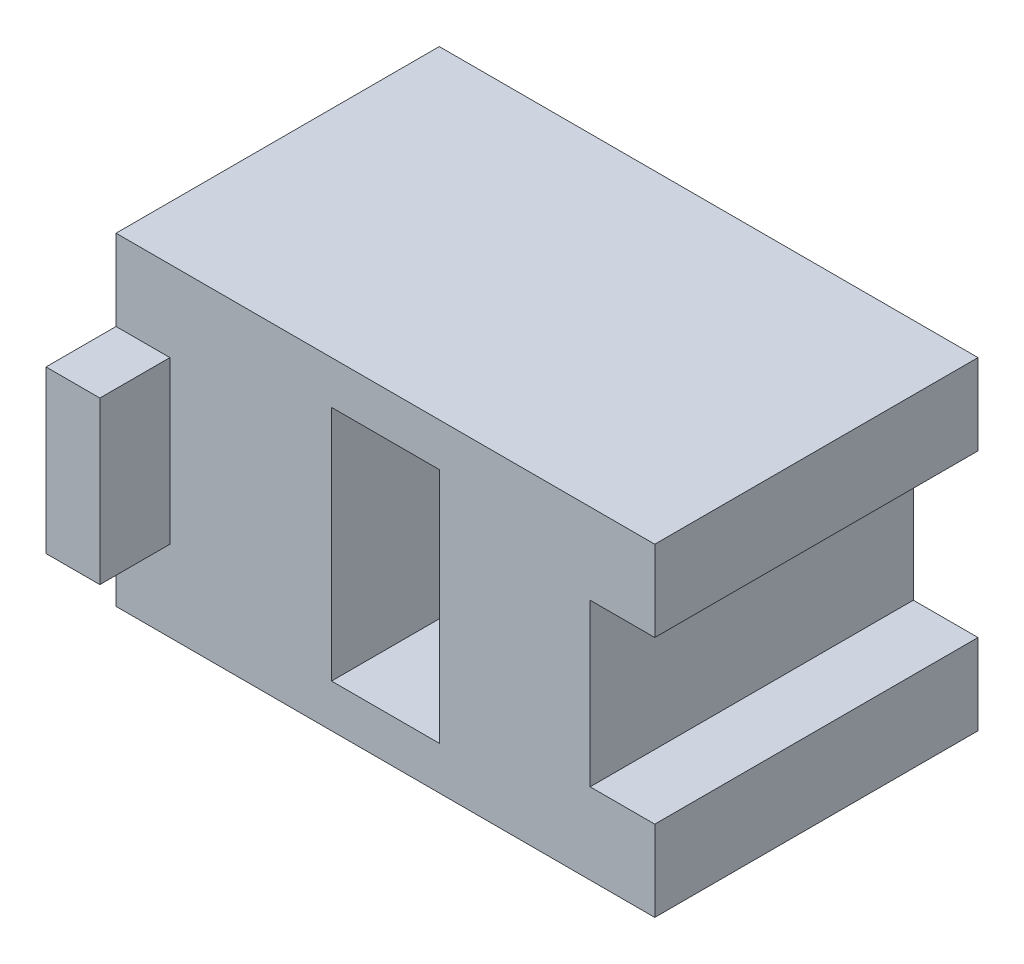
ISO-10303-21;
HEADER;
FILE_DESCRIPTION(('STEP AP214'),'2;1');
FILE_NAME('part.step','',(''),(''),'','','');
FILE_SCHEMA(('AUTOMOTIVE_DESIGN { 1 0 10303 214 1 1 1 1 }'));
ENDSEC;
DATA;
#1=APPLICATION_CONTEXT('core data for automotive mechanical design processes');
#2=APPLICATION_PROTOCOL_DEFINITION('international standard','automotive_design',2000,#1);
#3=PRODUCT_CONTEXT('',#1,'mechanical');
#4=PRODUCT('Part','Part','',(#3));
#5=PRODUCT_RELATED_PRODUCT_CATEGORY('part','',(#4));
#6=PRODUCT_DEFINITION_FORMATION('','',#4);
#7=PRODUCT_DEFINITION_CONTEXT('part definition',#1,'design');
#8=PRODUCT_DEFINITION('design','',#6,#7);
#9=PRODUCT_DEFINITION_SHAPE('','',#8);
#10=(LENGTH_UNIT() NAMED_UNIT(*) SI_UNIT(.MILLI.,.METRE.));
#11=(NAMED_UNIT(*) PLANE_ANGLE_UNIT() SI_UNIT($,.RADIAN.));
#12=(NAMED_UNIT(*) SI_UNIT($,.STERADIAN.) SOLID_ANGLE_UNIT());
#13=UNCERTAINTY_MEASURE_WITH_UNIT(LENGTH_MEASURE(1.E-05),#10,'distance_accuracy_value','');
#14=(GEOMETRIC_REPRESENTATION_CONTEXT(3) GLOBAL_UNCERTAINTY_ASSIGNED_CONTEXT((#13)) GLOBAL_UNIT_ASSIGNED_CONTEXT((#10,
#11,#12)) REPRESENTATION_CONTEXT('',''));
#15=CARTESIAN_POINT('',(0.,0.,0.));
#16=DIRECTION('',(0.,0.,1.));
#17=DIRECTION('',(1.,0.,0.));
#18=AXIS2_PLACEMENT_3D('',#15,#16,#17);
#19=CARTESIAN_POINT('',(0.,0.,30.));
#20=DIRECTION('',(0.,0.,-1.));
#21=DIRECTION('',(-1.,0.,0.));
#22=AXIS2_PLACEMENT_3D('',#19,#20,#21);
#23=PLANE('',#22);
#24=DIRECTION('',(-1.,0.,0.));
#25=VECTOR('',#24,1.);
#26=CARTESIAN_POINT('',(-5.,11.,30.));
#27=LINE('',#26,#25);
#28=CARTESIAN_POINT('',(5.,11.,30.));
#29=VERTEX_POINT('',#28);
#30=CARTESIAN_POINT('',(-5.,11.,30.));
#31=VERTEX_POINT('',#30);
#32=EDGE_CURVE('E219',#29,#31,#27,.T.);
#33=ORIENTED_EDGE('',*,*,#32,.F.);
#34=DIRECTION('',(0.,1.,0.));
#35=VECTOR('',#34,1.);
#36=CARTESIAN_POINT('',(5.,-11.,30.));
#37=LINE('',#36,#35);
#38=CARTESIAN_POINT('',(5.,-11.,30.));
#39=VERTEX_POINT('',#38);
#40=EDGE_CURVE('E217',#39,#29,#37,.T.);
#41=ORIENTED_EDGE('',*,*,#40,.F.);
#42=DIRECTION('',(1.,0.,0.));
#43=VECTOR('',#42,1.);
#44=CARTESIAN_POINT('',(-5.,-11.,30.));
#45=LINE('',#44,#43);
#46=CARTESIAN_POINT('',(-5.,-11.,30.));
#47=VERTEX_POINT('',#46);
#48=EDGE_CURVE('E225',#47,#39,#45,.T.);
#49=ORIENTED_EDGE('',*,*,#48,.F.);
#50=DIRECTION('',(0.,-1.,0.));
#51=VECTOR('',#50,1.);
#52=CARTESIAN_POINT('',(-5.,-11.,30.));
#53=LINE('',#52,#51);
#54=EDGE_CURVE('E223',#31,#47,#53,.T.);
#55=ORIENTED_EDGE('',*,*,#54,.F.);
#56=EDGE_LOOP('',(#33,#41,#49,#55));
#57=FACE_BOUND('',#56,.T.);
#58=DIRECTION('',(-1.,0.,0.));
#59=VECTOR('',#58,1.);
#60=CARTESIAN_POINT('',(-20.,7.5,30.));
#61=LINE('',#60,#59);
#62=CARTESIAN_POINT('',(-20.,7.5,30.));
#63=VERTEX_POINT('',#62);
#64=CARTESIAN_POINT('',(-25.,7.5,30.));
#65=VERTEX_POINT('',#64);
#66=EDGE_CURVE('E59',#63,#65,#61,.T.);
#67=ORIENTED_EDGE('',*,*,#66,.F.);
#68=DIRECTION('',(0.,1.,0.));
#69=VECTOR('',#68,1.);
#70=CARTESIAN_POINT('',(-20.,-7.5,30.));
#71=LINE('',#70,#69);
#72=CARTESIAN_POINT('',(-20.,-7.5,30.));
#73=VERTEX_POINT('',#72);
#74=EDGE_CURVE('E280',#73,#63,#71,.T.);
#75=ORIENTED_EDGE('',*,*,#74,.F.);
#76=DIRECTION('',(1.,0.,0.));
#77=VECTOR('',#76,1.);
#78=CARTESIAN_POINT('',(-20.,-7.5,30.));
#79=LINE('',#78,#77);
#80=CARTESIAN_POINT('',(-25.,-7.5,30.));
#81=VERTEX_POINT('',#80);
#82=EDGE_CURVE('E383',#81,#73,#79,.T.);
#83=ORIENTED_EDGE('',*,*,#82,.F.);
#84=DIRECTION('',(0.,-1.,0.));
#85=VECTOR('',#84,1.);
#86=CARTESIAN_POINT('',(-25.,-15.,30.));
#87=LINE('',#86,#85);
#88=CARTESIAN_POINT('',(-25.,-15.,30.));
#89=VERTEX_POINT('',#88);
#90=EDGE_CURVE('E244',#81,#89,#87,.T.);
#91=ORIENTED_EDGE('',*,*,#90,.T.);
#92=DIRECTION('',(1.,0.,0.));
#93=VECTOR('',#92,1.);
#94=CARTESIAN_POINT('',(-25.,-15.,30.));
#95=LINE('',#94,#93);
#96=CARTESIAN_POINT('',(25.,-15.,30.));
#97=VERTEX_POINT('',#96);
#98=EDGE_CURVE('E247',#89,#97,#95,.T.);
#99=ORIENTED_EDGE('',*,*,#98,.T.);
#100=DIRECTION('',(0.,1.,0.));
#101=VECTOR('',#100,1.);
#102=CARTESIAN_POINT('',(25.,-15.,30.));
#103=LINE('',#102,#101);
#104=CARTESIAN_POINT('',(25.,-7.5,30.));
#105=VERTEX_POINT('',#104);
#106=EDGE_CURVE('E238',#97,#105,#103,.T.);
#107=ORIENTED_EDGE('',*,*,#106,.T.);
#108=DIRECTION('',(1.,0.,0.));
#109=VECTOR('',#108,1.);
#110=CARTESIAN_POINT('',(19.,-7.5,30.));
#111=LINE('',#110,#109);
#112=CARTESIAN_POINT('',(19.,-7.5,30.));
#113=VERTEX_POINT('',#112);
#114=EDGE_CURVE('E297',#113,#105,#111,.T.);
#115=ORIENTED_EDGE('',*,*,#114,.F.);
#116=DIRECTION('',(0.,-1.,0.));
#117=VECTOR('',#116,1.);
#118=CARTESIAN_POINT('',(19.,-7.5,30.));
#119=LINE('',#118,#117);
#120=CARTESIAN_POINT('',(19.,7.5,30.));
#121=VERTEX_POINT('',#120);
#122=EDGE_CURVE('E307',#121,#113,#119,.T.);
#123=ORIENTED_EDGE('',*,*,#122,.F.);
#124=DIRECTION('',(-1.,0.,0.));
#125=VECTOR('',#124,1.);
#126=CARTESIAN_POINT('',(19.,7.5,30.));
#127=LINE('',#126,#125);
#128=CARTESIAN_POINT('',(25.,7.5,30.));
#129=VERTEX_POINT('',#128);
#130=EDGE_CURVE('E304',#129,#121,#127,.T.);
#131=ORIENTED_EDGE('',*,*,#130,.F.);
#132=CARTESIAN_POINT('',(25.,15.,30.));
#133=VERTEX_POINT('',#132);
#134=EDGE_CURVE('E242',#129,#133,#103,.T.);
#135=ORIENTED_EDGE('',*,*,#134,.T.);
#136=DIRECTION('',(-1.,0.,0.));
#137=VECTOR('',#136,1.);
#138=CARTESIAN_POINT('',(-25.,15.,30.));
#139=LINE('',#138,#137);
#140=CARTESIAN_POINT('',(-25.,15.,30.));
#141=VERTEX_POINT('',#140);
#142=EDGE_CURVE('E241',#133,#141,#139,.T.);
#143=ORIENTED_EDGE('',*,*,#142,.T.);
#144=EDGE_CURVE('E253',#141,#65,#87,.T.);
#145=ORIENTED_EDGE('',*,*,#144,.T.);
#146=EDGE_LOOP('',(#67,#75,#83,#91,#99,#107,#115,#123,#131,#135,#143,#145));
#147=FACE_BOUND('',#146,.T.);
#148=ADVANCED_FACE('F34',(#57,#147),#23,.F.);
#149=CARTESIAN_POINT('',(25.,-15.,30.));
#150=DIRECTION('',(-1.,0.,0.));
#151=DIRECTION('',(0.,0.,1.));
#152=AXIS2_PLACEMENT_3D('',#149,#150,#151);
#153=PLANE('',#152);
#154=DIRECTION('',(0.,1.,0.));
#155=VECTOR('',#154,1.);
#156=CARTESIAN_POINT('',(25.,-15.,0.));
#157=LINE('',#156,#155);
#158=CARTESIAN_POINT('',(25.,-15.,0.));
#159=VERTEX_POINT('',#158);
#160=CARTESIAN_POINT('',(25.,-7.5,0.));
#161=VERTEX_POINT('',#160);
#162=EDGE_CURVE('E370',#159,#161,#157,.T.);
#163=ORIENTED_EDGE('',*,*,#162,.T.);
#164=DIRECTION('',(0.,0.,1.));
#165=VECTOR('',#164,1.);
#166=CARTESIAN_POINT('',(25.,-7.5,0.));
#167=LINE('',#166,#165);
#168=EDGE_CURVE('E220',#161,#105,#167,.T.);
#169=ORIENTED_EDGE('',*,*,#168,.T.);
#170=ORIENTED_EDGE('',*,*,#106,.F.);
#171=DIRECTION('',(0.,0.,-1.));
#172=VECTOR('',#171,1.);
#173=CARTESIAN_POINT('',(25.,-15.,30.));
#174=LINE('',#173,#172);
#175=EDGE_CURVE('E260',#97,#159,#174,.T.);
#176=ORIENTED_EDGE('',*,*,#175,.T.);
#177=EDGE_LOOP('',(#163,#169,#170,#176));
#178=FACE_BOUND('',#177,.T.);
#179=ADVANCED_FACE('F340',(#178),#153,.F.);
#180=ORIENTED_EDGE('',*,*,#134,.F.);
#181=DIRECTION('',(0.,0.,1.));
#182=VECTOR('',#181,1.);
#183=CARTESIAN_POINT('',(25.,7.5,0.));
#184=LINE('',#183,#182);
#185=CARTESIAN_POINT('',(25.,7.5,0.));
#186=VERTEX_POINT('',#185);
#187=EDGE_CURVE('E303',#186,#129,#184,.T.);
#188=ORIENTED_EDGE('',*,*,#187,.F.);
#189=CARTESIAN_POINT('',(25.,15.,0.));
#190=VERTEX_POINT('',#189);
#191=EDGE_CURVE('E231',#186,#190,#157,.T.);
#192=ORIENTED_EDGE('',*,*,#191,.T.);
#193=DIRECTION('',(0.,0.,-1.));
#194=VECTOR('',#193,1.);
#195=CARTESIAN_POINT('',(25.,15.,30.));
#196=LINE('',#195,#194);
#197=EDGE_CURVE('E11',#133,#190,#196,.T.);
#198=ORIENTED_EDGE('',*,*,#197,.F.);
#199=EDGE_LOOP('',(#180,#188,#192,#198));
#200=FACE_BOUND('',#199,.T.);
#201=ADVANCED_FACE('F36',(#200),#153,.F.);
#202=CARTESIAN_POINT('',(-25.,15.,30.));
#203=DIRECTION('',(0.,-1.,0.));
#204=DIRECTION('',(0.,0.,-1.));
#205=AXIS2_PLACEMENT_3D('',#202,#203,#204);
#206=PLANE('',#205);
#207=DIRECTION('',(-1.,0.,0.));
#208=VECTOR('',#207,1.);
#209=CARTESIAN_POINT('',(-25.,15.,0.));
#210=LINE('',#209,#208);
#211=CARTESIAN_POINT('',(-25.,15.,0.));
#212=VERTEX_POINT('',#211);
#213=EDGE_CURVE('E267',#190,#212,#210,.T.);
#214=ORIENTED_EDGE('',*,*,#213,.T.);
#215=DIRECTION('',(0.,0.,-1.));
#216=VECTOR('',#215,1.);
#217=CARTESIAN_POINT('',(-25.,15.,30.));
#218=LINE('',#217,#216);
#219=EDGE_CURVE('E43',#141,#212,#218,.T.);
#220=ORIENTED_EDGE('',*,*,#219,.F.);
#221=ORIENTED_EDGE('',*,*,#142,.F.);
#222=ORIENTED_EDGE('',*,*,#197,.T.);
#223=EDGE_LOOP('',(#214,#220,#221,#222));
#224=FACE_BOUND('',#223,.T.);
#225=ADVANCED_FACE('F356',(#224),#206,.F.);
#226=CARTESIAN_POINT('',(-25.,-15.,30.));
#227=DIRECTION('',(1.,0.,0.));
#228=DIRECTION('',(0.,0.,-1.));
#229=AXIS2_PLACEMENT_3D('',#226,#227,#228);
#230=PLANE('',#229);
#231=DIRECTION('',(0.,-1.,0.));
#232=VECTOR('',#231,1.);
#233=CARTESIAN_POINT('',(-25.,-15.,0.));
#234=LINE('',#233,#232);
#235=CARTESIAN_POINT('',(-25.,6.,0.));
#236=VERTEX_POINT('',#235);
#237=EDGE_CURVE('E264',#212,#236,#234,.T.);
#238=ORIENTED_EDGE('',*,*,#237,.T.);
#239=DIRECTION('',(0.,0.,1.));
#240=VECTOR('',#239,1.);
#241=CARTESIAN_POINT('',(-25.,6.,0.));
#242=LINE('',#241,#240);
#243=CARTESIAN_POINT('',(-25.,6.,-5.));
#244=VERTEX_POINT('',#243);
#245=EDGE_CURVE('E176',#244,#236,#242,.T.);
#246=ORIENTED_EDGE('',*,*,#245,.F.);
#247=DIRECTION('',(0.,1.,0.));
#248=VECTOR('',#247,1.);
#249=CARTESIAN_POINT('',(-25.,-6.,-5.));
#250=LINE('',#249,#248);
#251=CARTESIAN_POINT('',(-25.,-6.,-5.));
#252=VERTEX_POINT('',#251);
#253=EDGE_CURVE('E173',#252,#244,#250,.T.);
#254=ORIENTED_EDGE('',*,*,#253,.F.);
#255=DIRECTION('',(0.,0.,1.));
#256=VECTOR('',#255,1.);
#257=CARTESIAN_POINT('',(-25.,-6.,0.));
#258=LINE('',#257,#256);
#259=CARTESIAN_POINT('',(-25.,-6.,0.));
#260=VERTEX_POINT('',#259);
#261=EDGE_CURVE('E193',#252,#260,#258,.T.);
#262=ORIENTED_EDGE('',*,*,#261,.T.);
#263=CARTESIAN_POINT('',(-25.,-15.,0.));
#264=VERTEX_POINT('',#263);
#265=EDGE_CURVE('E208',#260,#264,#234,.T.);
#266=ORIENTED_EDGE('',*,*,#265,.T.);
#267=DIRECTION('',(0.,0.,-1.));
#268=VECTOR('',#267,1.);
#269=CARTESIAN_POINT('',(-25.,-15.,30.));
#270=LINE('',#269,#268);
#271=EDGE_CURVE('E257',#89,#264,#270,.T.);
#272=ORIENTED_EDGE('',*,*,#271,.F.);
#273=ORIENTED_EDGE('',*,*,#90,.F.);
#274=DIRECTION('',(0.,0.,-1.));
#275=VECTOR('',#274,1.);
#276=CARTESIAN_POINT('',(-25.,-7.5,36.5));
#277=LINE('',#276,#275);
#278=CARTESIAN_POINT('',(-25.,-7.5,36.5));
#279=VERTEX_POINT('',#278);
#280=EDGE_CURVE('E292',#279,#81,#277,.T.);
#281=ORIENTED_EDGE('',*,*,#280,.F.);
#282=DIRECTION('',(0.,-1.,0.));
#283=VECTOR('',#282,1.);
#284=CARTESIAN_POINT('',(-25.,-7.5,36.5));
#285=LINE('',#284,#283);
#286=CARTESIAN_POINT('',(-25.,7.5,36.5));
#287=VERTEX_POINT('',#286);
#288=EDGE_CURVE('E279',#287,#279,#285,.T.);
#289=ORIENTED_EDGE('',*,*,#288,.F.);
#290=DIRECTION('',(0.,0.,-1.));
#291=VECTOR('',#290,1.);
#292=CARTESIAN_POINT('',(-25.,7.5,36.5));
#293=LINE('',#292,#291);
#294=EDGE_CURVE('E272',#287,#65,#293,.T.);
#295=ORIENTED_EDGE('',*,*,#294,.T.);
#296=ORIENTED_EDGE('',*,*,#144,.F.);
#297=ORIENTED_EDGE('',*,*,#219,.T.);
#298=EDGE_LOOP('',(#238,#246,#254,#262,#266,#272,#273,#281,#289,#295,#296,#297));
#299=FACE_BOUND('',#298,.T.);
#300=ADVANCED_FACE('F353',(#299),#230,.F.);
#301=CARTESIAN_POINT('',(-25.,-15.,30.));
#302=DIRECTION('',(0.,1.,0.));
#303=DIRECTION('',(0.,0.,1.));
#304=AXIS2_PLACEMENT_3D('',#301,#302,#303);
#305=PLANE('',#304);
#306=DIRECTION('',(1.,0.,0.));
#307=VECTOR('',#306,1.);
#308=CARTESIAN_POINT('',(-25.,-15.,0.));
#309=LINE('',#308,#307);
#310=EDGE_CURVE('E263',#264,#159,#309,.T.);
#311=ORIENTED_EDGE('',*,*,#310,.T.);
#312=ORIENTED_EDGE('',*,*,#175,.F.);
#313=ORIENTED_EDGE('',*,*,#98,.F.);
#314=ORIENTED_EDGE('',*,*,#271,.T.);
#315=EDGE_LOOP('',(#311,#312,#313,#314));
#316=FACE_BOUND('',#315,.T.);
#317=ADVANCED_FACE('F350',(#316),#305,.F.);
#318=CARTESIAN_POINT('',(0.,0.,0.));
#319=DIRECTION('',(0.,0.,-1.));
#320=DIRECTION('',(-1.,0.,0.));
#321=AXIS2_PLACEMENT_3D('',#318,#319,#320);
#322=PLANE('',#321);
#323=DIRECTION('',(1.,0.,0.));
#324=VECTOR('',#323,1.);
#325=CARTESIAN_POINT('',(-5.,6.,0.));
#326=LINE('',#325,#324);
#327=CARTESIAN_POINT('',(-5.,6.,0.));
#328=VERTEX_POINT('',#327);
#329=EDGE_CURVE('E177',#236,#328,#326,.T.);
#330=ORIENTED_EDGE('',*,*,#329,.F.);
#331=ORIENTED_EDGE('',*,*,#237,.F.);
#332=ORIENTED_EDGE('',*,*,#213,.F.);
#333=ORIENTED_EDGE('',*,*,#191,.F.);
#334=DIRECTION('',(-1.,0.,0.));
#335=VECTOR('',#334,1.);
#336=CARTESIAN_POINT('',(19.,7.5,0.));
#337=LINE('',#336,#335);
#338=CARTESIAN_POINT('',(19.,7.5,0.));
#339=VERTEX_POINT('',#338);
#340=EDGE_CURVE('E293',#186,#339,#337,.T.);
#341=ORIENTED_EDGE('',*,*,#340,.T.);
#342=DIRECTION('',(0.,-1.,0.));
#343=VECTOR('',#342,1.);
#344=CARTESIAN_POINT('',(19.,-7.5,0.));
#345=LINE('',#344,#343);
#346=CARTESIAN_POINT('',(19.,-7.5,0.));
#347=VERTEX_POINT('',#346);
#348=EDGE_CURVE('E296',#339,#347,#345,.T.);
#349=ORIENTED_EDGE('',*,*,#348,.T.);
#350=DIRECTION('',(1.,0.,0.));
#351=VECTOR('',#350,1.);
#352=CARTESIAN_POINT('',(19.,-7.5,0.));
#353=LINE('',#352,#351);
#354=EDGE_CURVE('E300',#347,#161,#353,.T.);
#355=ORIENTED_EDGE('',*,*,#354,.T.);
#356=ORIENTED_EDGE('',*,*,#162,.F.);
#357=ORIENTED_EDGE('',*,*,#310,.F.);
#358=ORIENTED_EDGE('',*,*,#265,.F.);
#359=DIRECTION('',(1.,0.,0.));
#360=VECTOR('',#359,1.);
#361=CARTESIAN_POINT('',(-5.,-6.,0.));
#362=LINE('',#361,#360);
#363=CARTESIAN_POINT('',(-5.,-6.,0.));
#364=VERTEX_POINT('',#363);
#365=EDGE_CURVE('E563',#260,#364,#362,.T.);
#366=ORIENTED_EDGE('',*,*,#365,.T.);
#367=DIRECTION('',(0.,-1.,0.));
#368=VECTOR('',#367,1.);
#369=CARTESIAN_POINT('',(-5.,-11.,0.));
#370=LINE('',#369,#368);
#371=CARTESIAN_POINT('',(-5.,-11.,0.));
#372=VERTEX_POINT('',#371);
#373=EDGE_CURVE('E192',#364,#372,#370,.T.);
#374=ORIENTED_EDGE('',*,*,#373,.T.);
#375=DIRECTION('',(1.,0.,0.));
#376=VECTOR('',#375,1.);
#377=CARTESIAN_POINT('',(-5.,-11.,0.));
#378=LINE('',#377,#376);
#379=CARTESIAN_POINT('',(5.,-11.,0.));
#380=VERTEX_POINT('',#379);
#381=EDGE_CURVE('E200',#372,#380,#378,.T.);
#382=ORIENTED_EDGE('',*,*,#381,.T.);
#383=DIRECTION('',(0.,1.,0.));
#384=VECTOR('',#383,1.);
#385=CARTESIAN_POINT('',(5.,-11.,0.));
#386=LINE('',#385,#384);
#387=CARTESIAN_POINT('',(5.,11.,0.));
#388=VERTEX_POINT('',#387);
#389=EDGE_CURVE('E228',#380,#388,#386,.T.);
#390=ORIENTED_EDGE('',*,*,#389,.T.);
#391=DIRECTION('',(-1.,0.,0.));
#392=VECTOR('',#391,1.);
#393=CARTESIAN_POINT('',(-5.,11.,0.));
#394=LINE('',#393,#392);
#395=CARTESIAN_POINT('',(-5.,11.,0.));
#396=VERTEX_POINT('',#395);
#397=EDGE_CURVE('E199',#388,#396,#394,.T.);
#398=ORIENTED_EDGE('',*,*,#397,.T.);
#399=EDGE_CURVE('E189',#396,#328,#370,.T.);
#400=ORIENTED_EDGE('',*,*,#399,.T.);
#401=EDGE_LOOP('',(#330,#331,#332,#333,#341,#349,#355,#356,#357,#358,#366,#374,#382,#390,#398,#400));
#402=FACE_BOUND('',#401,.T.);
#403=ADVANCED_FACE('F196',(#402),#322,.T.);
#404=CARTESIAN_POINT('',(5.,-11.,0.));
#405=DIRECTION('',(1.,0.,0.));
#406=DIRECTION('',(0.,0.,-1.));
#407=AXIS2_PLACEMENT_3D('',#404,#405,#406);
#408=PLANE('',#407);
#409=ORIENTED_EDGE('',*,*,#40,.T.);
#410=DIRECTION('',(0.,0.,1.));
#411=VECTOR('',#410,1.);
#412=CARTESIAN_POINT('',(5.,11.,0.));
#413=LINE('',#412,#411);
#414=EDGE_CURVE('E203',#388,#29,#413,.T.);
#415=ORIENTED_EDGE('',*,*,#414,.F.);
#416=ORIENTED_EDGE('',*,*,#389,.F.);
#417=DIRECTION('',(0.,0.,1.));
#418=VECTOR('',#417,1.);
#419=CARTESIAN_POINT('',(5.,-11.,0.));
#420=LINE('',#419,#418);
#421=EDGE_CURVE('E229',#380,#39,#420,.T.);
#422=ORIENTED_EDGE('',*,*,#421,.T.);
#423=EDGE_LOOP('',(#409,#415,#416,#422));
#424=FACE_BOUND('',#423,.T.);
#425=ADVANCED_FACE('F320',(#424),#408,.F.);
#426=CARTESIAN_POINT('',(-5.,-11.,0.));
#427=DIRECTION('',(0.,-1.,0.));
#428=DIRECTION('',(0.,0.,-1.));
#429=AXIS2_PLACEMENT_3D('',#426,#427,#428);
#430=PLANE('',#429);
#431=ORIENTED_EDGE('',*,*,#48,.T.);
#432=ORIENTED_EDGE('',*,*,#421,.F.);
#433=ORIENTED_EDGE('',*,*,#381,.F.);
#434=DIRECTION('',(0.,0.,1.));
#435=VECTOR('',#434,1.);
#436=CARTESIAN_POINT('',(-5.,-11.,0.));
#437=LINE('',#436,#435);
#438=EDGE_CURVE('E232',#372,#47,#437,.T.);
#439=ORIENTED_EDGE('',*,*,#438,.T.);
#440=EDGE_LOOP('',(#431,#432,#433,#439));
#441=FACE_BOUND('',#440,.T.);
#442=ADVANCED_FACE('F329',(#441),#430,.F.);
#443=CARTESIAN_POINT('',(-5.,-11.,0.));
#444=DIRECTION('',(-1.,0.,0.));
#445=DIRECTION('',(0.,0.,1.));
#446=AXIS2_PLACEMENT_3D('',#443,#444,#445);
#447=PLANE('',#446);
#448=ORIENTED_EDGE('',*,*,#54,.T.);
#449=ORIENTED_EDGE('',*,*,#438,.F.);
#450=ORIENTED_EDGE('',*,*,#373,.F.);
#451=DIRECTION('',(0.,1.,0.));
#452=VECTOR('',#451,1.);
#453=CARTESIAN_POINT('',(-5.,-6.,0.));
#454=LINE('',#453,#452);
#455=EDGE_CURVE('E171',#364,#328,#454,.T.);
#456=ORIENTED_EDGE('',*,*,#455,.T.);
#457=ORIENTED_EDGE('',*,*,#399,.F.);
#458=DIRECTION('',(0.,0.,1.));
#459=VECTOR('',#458,1.);
#460=CARTESIAN_POINT('',(-5.,11.,0.));
#461=LINE('',#460,#459);
#462=EDGE_CURVE('E234',#396,#31,#461,.T.);
#463=ORIENTED_EDGE('',*,*,#462,.T.);
#464=EDGE_LOOP('',(#448,#449,#450,#456,#457,#463));
#465=FACE_BOUND('',#464,.T.);
#466=ADVANCED_FACE('F188',(#465),#447,.F.);
#467=CARTESIAN_POINT('',(-5.,11.,0.));
#468=DIRECTION('',(0.,1.,0.));
#469=DIRECTION('',(0.,0.,1.));
#470=AXIS2_PLACEMENT_3D('',#467,#468,#469);
#471=PLANE('',#470);
#472=ORIENTED_EDGE('',*,*,#32,.T.);
#473=ORIENTED_EDGE('',*,*,#462,.F.);
#474=ORIENTED_EDGE('',*,*,#397,.F.);
#475=ORIENTED_EDGE('',*,*,#414,.T.);
#476=EDGE_LOOP('',(#472,#473,#474,#475));
#477=FACE_BOUND('',#476,.T.);
#478=ADVANCED_FACE('F324',(#477),#471,.F.);
#479=CARTESIAN_POINT('',(19.,-7.5,0.));
#480=DIRECTION('',(0.,-1.,0.));
#481=DIRECTION('',(0.,0.,-1.));
#482=AXIS2_PLACEMENT_3D('',#479,#480,#481);
#483=PLANE('',#482);
#484=ORIENTED_EDGE('',*,*,#114,.T.);
#485=ORIENTED_EDGE('',*,*,#168,.F.);
#486=ORIENTED_EDGE('',*,*,#354,.F.);
#487=DIRECTION('',(0.,0.,1.));
#488=VECTOR('',#487,1.);
#489=CARTESIAN_POINT('',(19.,-7.5,0.));
#490=LINE('',#489,#488);
#491=EDGE_CURVE('E313',#347,#113,#490,.T.);
#492=ORIENTED_EDGE('',*,*,#491,.T.);
#493=EDGE_LOOP('',(#484,#485,#486,#492));
#494=FACE_BOUND('',#493,.T.);
#495=ADVANCED_FACE('F404',(#494),#483,.F.);
#496=CARTESIAN_POINT('',(19.,-7.5,0.));
#497=DIRECTION('',(-1.,0.,0.));
#498=DIRECTION('',(0.,0.,1.));
#499=AXIS2_PLACEMENT_3D('',#496,#497,#498);
#500=PLANE('',#499);
#501=ORIENTED_EDGE('',*,*,#122,.T.);
#502=ORIENTED_EDGE('',*,*,#491,.F.);
#503=ORIENTED_EDGE('',*,*,#348,.F.);
#504=DIRECTION('',(0.,0.,1.));
#505=VECTOR('',#504,1.);
#506=CARTESIAN_POINT('',(19.,7.5,0.));
#507=LINE('',#506,#505);
#508=EDGE_CURVE('E315',#339,#121,#507,.T.);
#509=ORIENTED_EDGE('',*,*,#508,.T.);
#510=EDGE_LOOP('',(#501,#502,#503,#509));
#511=FACE_BOUND('',#510,.T.);
#512=ADVANCED_FACE('F407',(#511),#500,.F.);
#513=CARTESIAN_POINT('',(19.,7.5,0.));
#514=DIRECTION('',(0.,1.,0.));
#515=DIRECTION('',(0.,0.,1.));
#516=AXIS2_PLACEMENT_3D('',#513,#514,#515);
#517=PLANE('',#516);
#518=ORIENTED_EDGE('',*,*,#130,.T.);
#519=ORIENTED_EDGE('',*,*,#508,.F.);
#520=ORIENTED_EDGE('',*,*,#340,.F.);
#521=ORIENTED_EDGE('',*,*,#187,.T.);
#522=EDGE_LOOP('',(#518,#519,#520,#521));
#523=FACE_BOUND('',#522,.T.);
#524=ADVANCED_FACE('F409',(#523),#517,.F.);
#525=CARTESIAN_POINT('',(-20.,-7.5,36.5));
#526=DIRECTION('',(0.,1.,0.));
#527=DIRECTION('',(-1.,0.,0.));
#528=AXIS2_PLACEMENT_3D('',#525,#526,#527);
#529=PLANE('',#528);
#530=ORIENTED_EDGE('',*,*,#82,.T.);
#531=DIRECTION('',(0.,0.,-1.));
#532=VECTOR('',#531,1.);
#533=CARTESIAN_POINT('',(-20.,-7.5,36.5));
#534=LINE('',#533,#532);
#535=CARTESIAN_POINT('',(-20.,-7.5,36.5));
#536=VERTEX_POINT('',#535);
#537=EDGE_CURVE('E289',#536,#73,#534,.T.);
#538=ORIENTED_EDGE('',*,*,#537,.F.);
#539=DIRECTION('',(1.,0.,0.));
#540=VECTOR('',#539,1.);
#541=CARTESIAN_POINT('',(-20.,-7.5,36.5));
#542=LINE('',#541,#540);
#543=EDGE_CURVE('E391',#279,#536,#542,.T.);
#544=ORIENTED_EDGE('',*,*,#543,.F.);
#545=ORIENTED_EDGE('',*,*,#280,.T.);
#546=EDGE_LOOP('',(#530,#538,#544,#545));
#547=FACE_BOUND('',#546,.T.);
#548=ADVANCED_FACE('F390',(#547),#529,.F.);
#549=CARTESIAN_POINT('',(-20.,-7.5,36.5));
#550=DIRECTION('',(-1.,0.,0.));
#551=DIRECTION('',(0.,0.,1.));
#552=AXIS2_PLACEMENT_3D('',#549,#550,#551);
#553=PLANE('',#552);
#554=ORIENTED_EDGE('',*,*,#74,.T.);
#555=DIRECTION('',(0.,0.,-1.));
#556=VECTOR('',#555,1.);
#557=CARTESIAN_POINT('',(-20.,7.5,36.5));
#558=LINE('',#557,#556);
#559=CARTESIAN_POINT('',(-20.,7.5,36.5));
#560=VERTEX_POINT('',#559);
#561=EDGE_CURVE('E275',#560,#63,#558,.T.);
#562=ORIENTED_EDGE('',*,*,#561,.F.);
#563=DIRECTION('',(0.,1.,0.));
#564=VECTOR('',#563,1.);
#565=CARTESIAN_POINT('',(-20.,-7.5,36.5));
#566=LINE('',#565,#564);
#567=EDGE_CURVE('E380',#536,#560,#566,.T.);
#568=ORIENTED_EDGE('',*,*,#567,.F.);
#569=ORIENTED_EDGE('',*,*,#537,.T.);
#570=EDGE_LOOP('',(#554,#562,#568,#569));
#571=FACE_BOUND('',#570,.T.);
#572=ADVANCED_FACE('F379',(#571),#553,.F.);
#573=CARTESIAN_POINT('',(-20.,7.5,36.5));
#574=DIRECTION('',(0.,-1.,0.));
#575=DIRECTION('',(0.,0.,-1.));
#576=AXIS2_PLACEMENT_3D('',#573,#574,#575);
#577=PLANE('',#576);
#578=ORIENTED_EDGE('',*,*,#66,.T.);
#579=ORIENTED_EDGE('',*,*,#294,.F.);
#580=DIRECTION('',(-1.,0.,0.));
#581=VECTOR('',#580,1.);
#582=CARTESIAN_POINT('',(-20.,7.5,36.5));
#583=LINE('',#582,#581);
#584=EDGE_CURVE('E276',#560,#287,#583,.T.);
#585=ORIENTED_EDGE('',*,*,#584,.F.);
#586=ORIENTED_EDGE('',*,*,#561,.T.);
#587=EDGE_LOOP('',(#578,#579,#585,#586));
#588=FACE_BOUND('',#587,.T.);
#589=ADVANCED_FACE('F374',(#588),#577,.F.);
#590=CARTESIAN_POINT('',(0.,0.,36.5));
#591=DIRECTION('',(0.,0.,1.));
#592=DIRECTION('',(1.,0.,0.));
#593=AXIS2_PLACEMENT_3D('',#590,#591,#592);
#594=PLANE('',#593);
#595=ORIENTED_EDGE('',*,*,#288,.T.);
#596=ORIENTED_EDGE('',*,*,#543,.T.);
#597=ORIENTED_EDGE('',*,*,#567,.T.);
#598=ORIENTED_EDGE('',*,*,#584,.T.);
#599=EDGE_LOOP('',(#595,#596,#597,#598));
#600=FACE_BOUND('',#599,.T.);
#601=ADVANCED_FACE('F428',(#600),#594,.T.);
#602=CARTESIAN_POINT('',(-25.,-6.,-5.));
#603=DIRECTION('',(0.242535625036333,0.,-0.970142500145332));
#604=DIRECTION('',(-0.970142500145332,0.,-0.242535625036333));
#605=AXIS2_PLACEMENT_3D('',#602,#603,#604);
#606=PLANE('',#605);
#607=ORIENTED_EDGE('',*,*,#253,.T.);
#608=DIRECTION('',(-0.970142500145332,0.,-0.242535625036333));
#609=VECTOR('',#608,1.);
#610=CARTESIAN_POINT('',(-25.,6.,-5.));
#611=LINE('',#610,#609);
#612=EDGE_CURVE('E167',#328,#244,#611,.T.);
#613=ORIENTED_EDGE('',*,*,#612,.F.);
#614=ORIENTED_EDGE('',*,*,#455,.F.);
#615=DIRECTION('',(-0.970142500145332,0.,-0.242535625036333));
#616=VECTOR('',#615,1.);
#617=CARTESIAN_POINT('',(-25.,-6.,-5.));
#618=LINE('',#617,#616);
#619=EDGE_CURVE('E51',#364,#252,#618,.T.);
#620=ORIENTED_EDGE('',*,*,#619,.T.);
#621=EDGE_LOOP('',(#607,#613,#614,#620));
#622=FACE_BOUND('',#621,.T.);
#623=ADVANCED_FACE('F169',(#622),#606,.T.);
#624=CARTESIAN_POINT('',(0.,-6.,0.));
#625=DIRECTION('',(0.,-1.,0.));
#626=DIRECTION('',(0.,0.,-1.));
#627=AXIS2_PLACEMENT_3D('',#624,#625,#626);
#628=PLANE('',#627);
#629=ORIENTED_EDGE('',*,*,#365,.F.);
#630=ORIENTED_EDGE('',*,*,#261,.F.);
#631=ORIENTED_EDGE('',*,*,#619,.F.);
#632=EDGE_LOOP('',(#629,#630,#631));
#633=FACE_BOUND('',#632,.T.);
#634=ADVANCED_FACE('F434',(#633),#628,.T.);
#635=CARTESIAN_POINT('',(0.,6.,0.));
#636=DIRECTION('',(0.,-1.,0.));
#637=DIRECTION('',(0.,0.,-1.));
#638=AXIS2_PLACEMENT_3D('',#635,#636,#637);
#639=PLANE('',#638);
#640=ORIENTED_EDGE('',*,*,#329,.T.);
#641=ORIENTED_EDGE('',*,*,#612,.T.);
#642=ORIENTED_EDGE('',*,*,#245,.T.);
#643=EDGE_LOOP('',(#640,#641,#642));
#644=FACE_BOUND('',#643,.T.);
#645=ADVANCED_FACE('F179',(#644),#639,.F.);
#646=CLOSED_SHELL('',(#148,#179,#201,#225,#300,#317,#403,#425,#442,#466,#478,#495,#512,#524,
#548,#572,#589,#601,#623,#634,#645));
#647=MANIFOLD_SOLID_BREP('B2',#646);
#648=ADVANCED_BREP_SHAPE_REPRESENTATION('',(#18,#647),#14);
#649=SHAPE_DEFINITION_REPRESENTATION(#9,#648);
ENDSEC;
END-ISO-10303-21;
